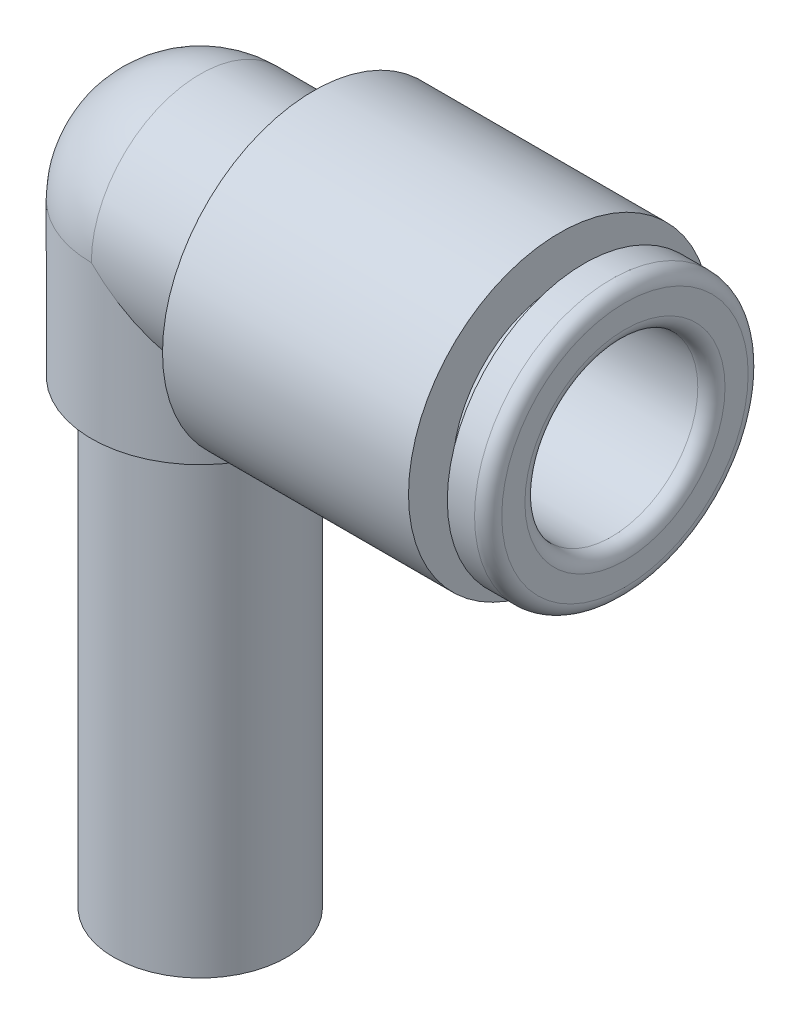
ISO-10303-21;
HEADER;
FILE_DESCRIPTION(('STEP AP214'),'2;1');
FILE_NAME('part.step','',(''),(''),'','','');
FILE_SCHEMA(('AUTOMOTIVE_DESIGN { 1 0 10303 214 1 1 1 1 }'));
ENDSEC;
DATA;
#1=APPLICATION_CONTEXT('core data for automotive mechanical design processes');
#2=APPLICATION_PROTOCOL_DEFINITION('international standard','automotive_design',2000,#1);
#3=PRODUCT_CONTEXT('',#1,'mechanical');
#4=PRODUCT('Part','Part','',(#3));
#5=PRODUCT_RELATED_PRODUCT_CATEGORY('part','',(#4));
#6=PRODUCT_DEFINITION_FORMATION('','',#4);
#7=PRODUCT_DEFINITION_CONTEXT('part definition',#1,'design');
#8=PRODUCT_DEFINITION('design','',#6,#7);
#9=PRODUCT_DEFINITION_SHAPE('','',#8);
#10=(LENGTH_UNIT() NAMED_UNIT(*) SI_UNIT(.MILLI.,.METRE.));
#11=(NAMED_UNIT(*) PLANE_ANGLE_UNIT() SI_UNIT($,.RADIAN.));
#12=(NAMED_UNIT(*) SI_UNIT($,.STERADIAN.) SOLID_ANGLE_UNIT());
#13=UNCERTAINTY_MEASURE_WITH_UNIT(LENGTH_MEASURE(1.E-05),#10,'distance_accuracy_value','');
#14=(GEOMETRIC_REPRESENTATION_CONTEXT(3) GLOBAL_UNCERTAINTY_ASSIGNED_CONTEXT((#13)) GLOBAL_UNIT_ASSIGNED_CONTEXT((#10,
#11,#12)) REPRESENTATION_CONTEXT('',''));
#15=CARTESIAN_POINT('',(0.,0.,0.));
#16=DIRECTION('',(0.,0.,1.));
#17=DIRECTION('',(1.,0.,0.));
#18=AXIS2_PLACEMENT_3D('',#15,#16,#17);
#19=CARTESIAN_POINT('',(15.1,0.,0.));
#20=DIRECTION('',(-1.,0.,0.));
#21=DIRECTION('',(0.,0.,1.));
#22=AXIS2_PLACEMENT_3D('',#19,#20,#21);
#23=TOROIDAL_SURFACE('',#22,4.525,0.5);
#24=CARTESIAN_POINT('',(15.1,0.,0.));
#25=DIRECTION('',(-1.,0.,0.));
#26=DIRECTION('',(0.,0.,1.));
#27=AXIS2_PLACEMENT_3D('',#24,#25,#26);
#28=CIRCLE('',#27,5.025);
#29=CARTESIAN_POINT('',(15.1,0.,5.025));
#30=VERTEX_POINT('',#29);
#31=EDGE_CURVE('E192',#30,#30,#28,.T.);
#32=ORIENTED_EDGE('',*,*,#31,.F.);
#33=EDGE_LOOP('',(#32));
#34=FACE_BOUND('',#33,.T.);
#35=CARTESIAN_POINT('',(15.6,0.,0.));
#36=DIRECTION('',(-1.,0.,0.));
#37=DIRECTION('',(0.,0.,1.));
#38=AXIS2_PLACEMENT_3D('',#35,#36,#37);
#39=CIRCLE('',#38,4.525);
#40=CARTESIAN_POINT('',(15.6,0.,4.525));
#41=VERTEX_POINT('',#40);
#42=CARTESIAN_POINT('',(15.6,0.,-4.525));
#43=VERTEX_POINT('',#42);
#44=EDGE_CURVE('E179',#41,#43,#39,.T.);
#45=ORIENTED_EDGE('',*,*,#44,.T.);
#46=CARTESIAN_POINT('',(15.6,0.,0.));
#47=DIRECTION('',(-1.,0.,0.));
#48=DIRECTION('',(0.,0.,-1.));
#49=AXIS2_PLACEMENT_3D('',#46,#47,#48);
#50=CIRCLE('',#49,4.525);
#51=EDGE_CURVE('E475',#43,#41,#50,.T.);
#52=ORIENTED_EDGE('',*,*,#51,.T.);
#53=EDGE_LOOP('',(#45,#52));
#54=FACE_BOUND('',#53,.T.);
#55=ADVANCED_FACE('F16',(#34,#54),#23,.T.);
#56=CARTESIAN_POINT('',(15.6,4.525,0.));
#57=DIRECTION('',(-1.,0.,0.));
#58=DIRECTION('',(0.,0.,1.));
#59=AXIS2_PLACEMENT_3D('',#56,#57,#58);
#60=PLANE('',#59);
#61=ORIENTED_EDGE('',*,*,#51,.F.);
#62=ORIENTED_EDGE('',*,*,#44,.F.);
#63=EDGE_LOOP('',(#61,#62));
#64=FACE_BOUND('',#63,.T.);
#65=CARTESIAN_POINT('',(15.6,0.,0.));
#66=DIRECTION('',(1.,0.,0.));
#67=DIRECTION('',(0.,0.,1.));
#68=AXIS2_PLACEMENT_3D('',#65,#66,#67);
#69=CIRCLE('',#68,3.675);
#70=CARTESIAN_POINT('',(15.6,0.,3.675));
#71=VERTEX_POINT('',#70);
#72=CARTESIAN_POINT('',(15.6,0.,-3.675));
#73=VERTEX_POINT('',#72);
#74=EDGE_CURVE('E146',#71,#73,#69,.T.);
#75=ORIENTED_EDGE('',*,*,#74,.F.);
#76=CARTESIAN_POINT('',(15.6,0.,0.));
#77=DIRECTION('',(1.,0.,0.));
#78=DIRECTION('',(0.,0.,-1.));
#79=AXIS2_PLACEMENT_3D('',#76,#77,#78);
#80=CIRCLE('',#79,3.675);
#81=EDGE_CURVE('E188',#73,#71,#80,.T.);
#82=ORIENTED_EDGE('',*,*,#81,.F.);
#83=EDGE_LOOP('',(#75,#82));
#84=FACE_BOUND('',#83,.T.);
#85=ADVANCED_FACE('F152',(#64,#84),#60,.F.);
#86=CARTESIAN_POINT('',(12.5977223806421,0.,0.));
#87=DIRECTION('',(-1.,0.,0.));
#88=DIRECTION('',(0.,0.,1.));
#89=AXIS2_PLACEMENT_3D('',#86,#87,#88);
#90=CYLINDRICAL_SURFACE('',#89,5.025);
#91=CARTESIAN_POINT('',(14.1,0.,0.));
#92=DIRECTION('',(-1.,0.,0.));
#93=DIRECTION('',(0.,0.,1.));
#94=AXIS2_PLACEMENT_3D('',#91,#92,#93);
#95=CIRCLE('',#94,5.025);
#96=CARTESIAN_POINT('',(14.1,0.,5.025));
#97=VERTEX_POINT('',#96);
#98=EDGE_CURVE('E461',#97,#97,#95,.F.);
#99=ORIENTED_EDGE('',*,*,#98,.T.);
#100=EDGE_LOOP('',(#99));
#101=FACE_BOUND('',#100,.T.);
#102=ORIENTED_EDGE('',*,*,#31,.T.);
#103=EDGE_LOOP('',(#102));
#104=FACE_BOUND('',#103,.T.);
#105=ADVANCED_FACE('F134',(#101,#104),#90,.T.);
#106=CARTESIAN_POINT('',(15.1,0.,0.));
#107=DIRECTION('',(-1.,0.,0.));
#108=DIRECTION('',(0.,0.,1.));
#109=AXIS2_PLACEMENT_3D('',#106,#107,#108);
#110=TOROIDAL_SURFACE('',#109,3.675,0.5);
#111=ORIENTED_EDGE('',*,*,#74,.T.);
#112=ORIENTED_EDGE('',*,*,#81,.T.);
#113=EDGE_LOOP('',(#111,#112));
#114=FACE_BOUND('',#113,.T.);
#115=CARTESIAN_POINT('',(15.1,0.,0.));
#116=DIRECTION('',(1.,0.,0.));
#117=DIRECTION('',(0.,0.,-1.));
#118=AXIS2_PLACEMENT_3D('',#115,#116,#117);
#119=CIRCLE('',#118,3.175);
#120=CARTESIAN_POINT('',(15.1,0.,-3.175));
#121=VERTEX_POINT('',#120);
#122=EDGE_CURVE('E141',#121,#121,#119,.F.);
#123=ORIENTED_EDGE('',*,*,#122,.T.);
#124=EDGE_LOOP('',(#123));
#125=FACE_BOUND('',#124,.T.);
#126=ADVANCED_FACE('F128',(#114,#125),#110,.T.);
#127=CARTESIAN_POINT('',(14.1,3.925,0.));
#128=DIRECTION('',(1.,0.,0.));
#129=DIRECTION('',(0.,0.,-1.));
#130=AXIS2_PLACEMENT_3D('',#127,#128,#129);
#131=PLANE('',#130);
#132=ORIENTED_EDGE('',*,*,#98,.F.);
#133=EDGE_LOOP('',(#132));
#134=FACE_BOUND('',#133,.T.);
#135=CARTESIAN_POINT('',(14.1,0.,0.));
#136=DIRECTION('',(-1.,0.,0.));
#137=DIRECTION('',(0.,0.,1.));
#138=AXIS2_PLACEMENT_3D('',#135,#136,#137);
#139=CIRCLE('',#138,3.925);
#140=CARTESIAN_POINT('',(14.1,0.,3.925));
#141=VERTEX_POINT('',#140);
#142=EDGE_CURVE('E464',#141,#141,#139,.T.);
#143=ORIENTED_EDGE('',*,*,#142,.F.);
#144=EDGE_LOOP('',(#143));
#145=FACE_BOUND('',#144,.T.);
#146=ADVANCED_FACE('F124',(#134,#145),#131,.F.);
#147=CARTESIAN_POINT('',(-6.68025612106916,0.,0.));
#148=DIRECTION('',(1.,0.,0.));
#149=DIRECTION('',(0.,0.,-1.));
#150=AXIS2_PLACEMENT_3D('',#147,#148,#149);
#151=CYLINDRICAL_SURFACE('',#150,3.175);
#152=CARTESIAN_POINT('',(2.3,0.,0.));
#153=DIRECTION('',(1.,0.,0.));
#154=DIRECTION('',(0.,0.,-1.));
#155=AXIS2_PLACEMENT_3D('',#152,#153,#154);
#156=CIRCLE('',#155,3.175);
#157=CARTESIAN_POINT('',(2.3,0.,-3.175));
#158=VERTEX_POINT('',#157);
#159=EDGE_CURVE('E480',#158,#158,#156,.T.);
#160=ORIENTED_EDGE('',*,*,#159,.F.);
#161=EDGE_LOOP('',(#160));
#162=FACE_BOUND('',#161,.T.);
#163=ORIENTED_EDGE('',*,*,#122,.F.);
#164=EDGE_LOOP('',(#163));
#165=FACE_BOUND('',#164,.T.);
#166=ADVANCED_FACE('F120',(#162,#165),#151,.F.);
#167=CARTESIAN_POINT('',(12.5977223806421,0.,0.));
#168=DIRECTION('',(-1.,0.,0.));
#169=DIRECTION('',(0.,0.,1.));
#170=AXIS2_PLACEMENT_3D('',#167,#168,#169);
#171=CYLINDRICAL_SURFACE('',#170,3.925);
#172=ORIENTED_EDGE('',*,*,#142,.T.);
#173=EDGE_LOOP('',(#172));
#174=FACE_BOUND('',#173,.T.);
#175=CARTESIAN_POINT('',(13.2,0.,0.));
#176=DIRECTION('',(-1.,0.,0.));
#177=DIRECTION('',(0.,0.,1.));
#178=AXIS2_PLACEMENT_3D('',#175,#176,#177);
#179=CIRCLE('',#178,3.925);
#180=CARTESIAN_POINT('',(13.2,0.,3.925));
#181=VERTEX_POINT('',#180);
#182=EDGE_CURVE('E104',#181,#181,#179,.T.);
#183=ORIENTED_EDGE('',*,*,#182,.F.);
#184=EDGE_LOOP('',(#183));
#185=FACE_BOUND('',#184,.T.);
#186=ADVANCED_FACE('F116',(#174,#185),#171,.T.);
#187=CARTESIAN_POINT('',(2.3,0.,0.));
#188=DIRECTION('',(1.,0.,0.));
#189=DIRECTION('',(0.,0.,-1.));
#190=AXIS2_PLACEMENT_3D('',#187,#188,#189);
#191=PLANE('',#190);
#192=ORIENTED_EDGE('',*,*,#159,.T.);
#193=EDGE_LOOP('',(#192));
#194=FACE_BOUND('',#193,.T.);
#195=CARTESIAN_POINT('',(2.3,1.5875,0.));
#196=CARTESIAN_POINT('',(2.3,1.58749495491175,-0.0891042427531741));
#197=CARTESIAN_POINT('',(2.3,1.5799567594767,-0.178367065825004));
#198=CARTESIAN_POINT('',(2.3,1.55752593931099,-0.310284978882648));
#199=CARTESIAN_POINT('',(2.3,1.54817551801793,-0.353984136220303));
#200=CARTESIAN_POINT('',(2.3,1.52581986383247,-0.440482597009062));
#201=CARTESIAN_POINT('',(2.3,1.51281166503759,-0.483281139802836));
#202=CARTESIAN_POINT('',(2.3,1.46847935042481,-0.609650731482703));
#203=CARTESIAN_POINT('',(2.3,1.43181110468509,-0.691408444623856));
#204=CARTESIAN_POINT('',(2.3,1.34525124947605,-0.847600873434349));
#205=CARTESIAN_POINT('',(2.3,1.29535913733055,-0.92203531057795));
#206=CARTESIAN_POINT('',(2.3,1.21173203000345,-1.02657774769047));
#207=CARTESIAN_POINT('',(2.3,1.18236942307022,-1.06026005137225));
#208=CARTESIAN_POINT('',(2.3,1.12094417118544,-1.12500228697802));
#209=CARTESIAN_POINT('',(2.3,1.08888415677228,-1.15606471595275));
#210=CARTESIAN_POINT('',(2.3,0.988914300007536,-1.24505027809715));
#211=CARTESIAN_POINT('',(2.3,0.91719651899173,-1.29879429940031));
#212=CARTESIAN_POINT('',(2.3,0.765794987238496,-1.39344725535452));
#213=CARTESIAN_POINT('',(2.3,0.68611153702384,-1.43435667397899));
#214=CARTESIAN_POINT('',(2.3,0.520998674629221,-1.50222466101312));
#215=CARTESIAN_POINT('',(2.3,0.435569323829171,-1.52918337842279));
#216=CARTESIAN_POINT('',(2.3,0.261399162889878,-1.56837371201757));
#217=CARTESIAN_POINT('',(2.3,0.172658335068551,-1.5806052495533));
#218=CARTESIAN_POINT('',(2.3,-0.00561731240755867,-1.58999757905017));
#219=CARTESIAN_POINT('',(2.3,-0.0951521320623415,-1.58715837101132));
#220=CARTESIAN_POINT('',(2.3,-0.272476104421436,-1.56648626333742));
#221=CARTESIAN_POINT('',(2.3,-0.360265266445705,-1.54865344377437));
#222=CARTESIAN_POINT('',(2.3,-0.531595441405979,-1.49851072605493));
#223=CARTESIAN_POINT('',(2.3,-0.615136408958334,-1.46620067327378));
#224=CARTESIAN_POINT('',(2.3,-0.775645641169254,-1.38798052073523));
#225=CARTESIAN_POINT('',(2.3,-0.852613657823175,-1.3420699081056));
#226=CARTESIAN_POINT('',(2.3,-0.961380423495979,-1.26408149090922));
#227=CARTESIAN_POINT('',(2.3,-0.996526902392936,-1.23655978966952));
#228=CARTESIAN_POINT('',(2.3,-1.06441502738068,-1.1786303401124));
#229=CARTESIAN_POINT('',(2.3,-1.097154319878,-1.14821983215871));
#230=CARTESIAN_POINT('',(2.3,-1.19130347726346,-1.05304341490668));
#231=CARTESIAN_POINT('',(2.3,-1.24874073602495,-0.984263551623961));
#232=CARTESIAN_POINT('',(2.3,-1.35123363022916,-0.838031236490894));
#233=CARTESIAN_POINT('',(2.3,-1.39628973629864,-0.760579114444078));
#234=CARTESIAN_POINT('',(2.3,-1.45365516445471,-0.639567398181835));
#235=CARTESIAN_POINT('',(2.3,-1.47108849203858,-0.598372646204052));
#236=CARTESIAN_POINT('',(2.3,-1.50240938310877,-0.514702097171229));
#237=CARTESIAN_POINT('',(2.3,-1.51629981615103,-0.472227368210621));
#238=CARTESIAN_POINT('',(2.3,-1.55246799527504,-0.343396703003752));
#239=CARTESIAN_POINT('',(2.3,-1.56934392647251,-0.255420121350519));
#240=CARTESIAN_POINT('',(2.3,-1.5816411099694,-0.139100766828972));
#241=CARTESIAN_POINT('',(2.3,-1.58383629738819,-0.111329870710185));
#242=CARTESIAN_POINT('',(2.3,-1.58676653121529,-0.055711151950809));
#243=CARTESIAN_POINT('',(2.3,-1.58750157762359,-0.0278633293102198));
#244=CARTESIAN_POINT('',(2.3,-1.58749495491175,0.0891042427531827));
#245=CARTESIAN_POINT('',(2.3,-1.5799567594767,0.178367065825021));
#246=CARTESIAN_POINT('',(2.3,-1.55752593931099,0.310284978882677));
#247=CARTESIAN_POINT('',(2.3,-1.54817551801793,0.353984136220336));
#248=CARTESIAN_POINT('',(2.3,-1.52581986383246,0.440482597009103));
#249=CARTESIAN_POINT('',(2.3,-1.51281166503757,0.48328113980288));
#250=CARTESIAN_POINT('',(2.3,-1.46847935042479,0.609650731482749));
#251=CARTESIAN_POINT('',(2.3,-1.43181110468507,0.691408444623901));
#252=CARTESIAN_POINT('',(2.3,-1.34525124947603,0.847600873434392));
#253=CARTESIAN_POINT('',(2.3,-1.29535913733053,0.922035310577991));
#254=CARTESIAN_POINT('',(2.3,-1.21173203000341,1.02657774769051));
#255=CARTESIAN_POINT('',(2.3,-1.18236942307018,1.06026005137229));
#256=CARTESIAN_POINT('',(2.3,-1.1209441711854,1.12500228697806));
#257=CARTESIAN_POINT('',(2.3,-1.08888415677224,1.15606471595278));
#258=CARTESIAN_POINT('',(2.3,-0.988914300007496,1.24505027809718));
#259=CARTESIAN_POINT('',(2.3,-0.917196518991689,1.29879429940034));
#260=CARTESIAN_POINT('',(2.3,-0.765794987238453,1.39344725535454));
#261=CARTESIAN_POINT('',(2.3,-0.686111537023795,1.43435667397901));
#262=CARTESIAN_POINT('',(2.3,-0.520998674629174,1.50222466101314));
#263=CARTESIAN_POINT('',(2.3,-0.435569323829124,1.5291833784228));
#264=CARTESIAN_POINT('',(2.3,-0.26139916288983,1.56837371201758));
#265=CARTESIAN_POINT('',(2.3,-0.172658335068503,1.58060524955331));
#266=CARTESIAN_POINT('',(2.3,0.00561731240760763,1.58999757905017));
#267=CARTESIAN_POINT('',(2.3,0.0951521320623905,1.58715837101131));
#268=CARTESIAN_POINT('',(2.3,0.272476104421484,1.56648626333742));
#269=CARTESIAN_POINT('',(2.3,0.360265266445752,1.54865344377436));
#270=CARTESIAN_POINT('',(2.3,0.531595441406026,1.49851072605491));
#271=CARTESIAN_POINT('',(2.3,0.615136408958379,1.46620067327377));
#272=CARTESIAN_POINT('',(2.3,0.775645641169297,1.3879805207352));
#273=CARTESIAN_POINT('',(2.3,0.852613657823216,1.34206990810557));
#274=CARTESIAN_POINT('',(2.3,0.961380423496018,1.26408149090919));
#275=CARTESIAN_POINT('',(2.3,0.996526902392974,1.23655978966949));
#276=CARTESIAN_POINT('',(2.3,1.06441502738072,1.17863034011237));
#277=CARTESIAN_POINT('',(2.3,1.09715431987803,1.14821983215867));
#278=CARTESIAN_POINT('',(2.3,1.1913034772635,1.05304341490664));
#279=CARTESIAN_POINT('',(2.3,1.24874073602498,0.984263551623922));
#280=CARTESIAN_POINT('',(2.3,1.35123363022918,0.838031236490852));
#281=CARTESIAN_POINT('',(2.3,1.39628973629866,0.760579114444035));
#282=CARTESIAN_POINT('',(2.3,1.45365516445473,0.63956739818179));
#283=CARTESIAN_POINT('',(2.3,1.4710884920386,0.598372646204007));
#284=CARTESIAN_POINT('',(2.3,1.50240938310878,0.514702097171183));
#285=CARTESIAN_POINT('',(2.3,1.51629981615105,0.472227368210575));
#286=CARTESIAN_POINT('',(2.3,1.55246799527505,0.343396703003704));
#287=CARTESIAN_POINT('',(2.3,1.56934392647252,0.255420121350471));
#288=CARTESIAN_POINT('',(2.3,1.5816411099694,0.139100766828931));
#289=CARTESIAN_POINT('',(2.3,1.58383629738819,0.111329870710153));
#290=CARTESIAN_POINT('',(2.3,1.58676653121529,0.0557111519507928));
#291=CARTESIAN_POINT('',(2.3,1.58750157762359,0.0278633293102118));
#292=CARTESIAN_POINT('',(2.3,1.5875,0.));
#293=B_SPLINE_CURVE_WITH_KNOTS('',3,(#195,#196,#197,#198,#199,#200,#201,#202,#203,#204,#205,
#206,#207,#208,#209,#210,#211,#212,#213,#214,#215,#216,#217,#218,#219,#220,#221,#222,#223,#224,
#225,#226,#227,#228,#229,#230,#231,#232,#233,#234,#235,#236,#237,#238,#239,#240,#241,#242,#243,
#244,#245,#246,#247,#248,#249,#250,#251,#252,#253,#254,#255,#256,#257,#258,#259,#260,#261,#262,
#263,#264,#265,#266,#267,#268,#269,#270,#271,#272,#273,#274,#275,#276,#277,#278,#279,#280,#281,
#282,#283,#284,#285,#286,#287,#288,#289,#290,#291,#292),.UNSPECIFIED.,.T.,.F.,(4,2,2,2,2,2,2,2,
2,2,2,2,2,2,2,2,2,2,2,2,2,2,2,2,2,2,2,2,2,2,2,2,2,2,2,2,2,2,2,2,2,2,2,2,2,2,2,2,4),(0.,
0.267183072661366,0.401125762560115,0.535177374399008,0.802641589880362,1.07011597388379,
1.20402841156871,1.33781173749441,1.60529255313183,1.87276328126013,2.14023115261725,
2.40770045235999,2.67516975210272,2.94263762345984,3.21010835158814,3.47758916722556,
3.61137249315127,3.74528493083618,4.01275931483961,4.28022353032096,4.41427514215986,
4.54821783205861,4.81540090471997,4.89895034871561,4.98249979271125,5.24968286537264,
5.3836255552714,5.51767716711031,5.78514138259166,6.05261576659509,6.18652820428,
6.32031153020571,6.58779234584313,6.85526307397143,7.12273094532855,7.39020024507128,
7.65766954481402,7.92513741617114,8.19260814429943,8.46008895993686,8.59387228586256,
8.72778472354748,8.9952591075509,9.26272332303226,9.39677493487115,9.5307176247699,
9.79790069743127,9.88145014142688,9.96499958542249),.UNSPECIFIED.);
#294=CARTESIAN_POINT('',(2.3,1.5875,0.));
#295=VERTEX_POINT('',#294);
#296=EDGE_CURVE('E96',#295,#295,#293,.T.);
#297=ORIENTED_EDGE('',*,*,#296,.T.);
#298=EDGE_LOOP('',(#297));
#299=FACE_BOUND('',#298,.T.);
#300=ADVANCED_FACE('F111',(#194,#299),#191,.T.);
#301=CARTESIAN_POINT('',(13.2,0.,0.));
#302=DIRECTION('',(1.,0.,0.));
#303=DIRECTION('',(0.,0.,-1.));
#304=AXIS2_PLACEMENT_3D('',#301,#302,#303);
#305=PLANE('',#304);
#306=ORIENTED_EDGE('',*,*,#182,.T.);
#307=EDGE_LOOP('',(#306));
#308=FACE_BOUND('',#307,.T.);
#309=CARTESIAN_POINT('',(13.2,0.,0.));
#310=DIRECTION('',(-1.,0.,0.));
#311=DIRECTION('',(0.,0.,1.));
#312=AXIS2_PLACEMENT_3D('',#309,#310,#311);
#313=CIRCLE('',#312,5.55);
#314=CARTESIAN_POINT('',(13.2,0.,5.55));
#315=VERTEX_POINT('',#314);
#316=EDGE_CURVE('E92',#315,#315,#313,.T.);
#317=ORIENTED_EDGE('',*,*,#316,.F.);
#318=EDGE_LOOP('',(#317));
#319=FACE_BOUND('',#318,.T.);
#320=ADVANCED_FACE('F115',(#308,#319),#305,.T.);
#321=CARTESIAN_POINT('',(2.3,-2.29999999999993,0.));
#322=DIRECTION('',(0.,0.,-1.));
#323=DIRECTION('',(-1.,0.,0.));
#324=AXIS2_PLACEMENT_3D('',#321,#322,#323);
#325=TOROIDAL_SURFACE('',#324,2.29999999999993,1.5875);
#326=CARTESIAN_POINT('',(0.,-2.29999999999993,0.));
#327=DIRECTION('',(0.,-1.,0.));
#328=DIRECTION('',(0.,0.,-1.));
#329=AXIS2_PLACEMENT_3D('',#326,#327,#328);
#330=CIRCLE('',#329,1.5875);
#331=CARTESIAN_POINT('',(0.,-2.29999999999993,-1.5875));
#332=VERTEX_POINT('',#331);
#333=EDGE_CURVE('E95',#332,#332,#330,.T.);
#334=ORIENTED_EDGE('',*,*,#333,.T.);
#335=EDGE_LOOP('',(#334));
#336=FACE_BOUND('',#335,.T.);
#337=ORIENTED_EDGE('',*,*,#296,.F.);
#338=EDGE_LOOP('',(#337));
#339=FACE_BOUND('',#338,.T.);
#340=ADVANCED_FACE('F106',(#336,#339),#325,.F.);
#341=CARTESIAN_POINT('',(28.8977705423414,0.,0.));
#342=DIRECTION('',(-1.,0.,0.));
#343=DIRECTION('',(0.,0.,1.));
#344=AXIS2_PLACEMENT_3D('',#341,#342,#343);
#345=CYLINDRICAL_SURFACE('',#344,5.55);
#346=ORIENTED_EDGE('',*,*,#316,.T.);
#347=EDGE_LOOP('',(#346));
#348=FACE_BOUND('',#347,.T.);
#349=CARTESIAN_POINT('',(4.16415386311542,0.,0.));
#350=DIRECTION('',(1.,0.,0.));
#351=DIRECTION('',(0.,0.,-1.));
#352=AXIS2_PLACEMENT_3D('',#349,#350,#351);
#353=CIRCLE('',#352,5.55000000002792);
#354=CARTESIAN_POINT('',(4.16415386311542,0.,-5.55000000002792));
#355=VERTEX_POINT('',#354);
#356=EDGE_CURVE('E71',#355,#355,#353,.F.);
#357=ORIENTED_EDGE('',*,*,#356,.F.);
#358=EDGE_LOOP('',(#357));
#359=FACE_BOUND('',#358,.T.);
#360=ADVANCED_FACE('F239',(#348,#359),#345,.T.);
#361=CARTESIAN_POINT('',(0.,5.551,0.));
#362=DIRECTION('',(0.,-1.,0.));
#363=DIRECTION('',(0.,0.,-1.));
#364=AXIS2_PLACEMENT_3D('',#361,#362,#363);
#365=CYLINDRICAL_SURFACE('',#364,1.5875);
#366=CARTESIAN_POINT('',(0.,-22.8,0.));
#367=DIRECTION('',(0.,-1.,0.));
#368=DIRECTION('',(0.,0.,-1.));
#369=AXIS2_PLACEMENT_3D('',#366,#367,#368);
#370=CIRCLE('',#369,1.5875);
#371=CARTESIAN_POINT('',(0.,-22.8,-1.5875));
#372=VERTEX_POINT('',#371);
#373=EDGE_CURVE('E80',#372,#372,#370,.T.);
#374=ORIENTED_EDGE('',*,*,#373,.T.);
#375=EDGE_LOOP('',(#374));
#376=FACE_BOUND('',#375,.T.);
#377=ORIENTED_EDGE('',*,*,#333,.F.);
#378=EDGE_LOOP('',(#377));
#379=FACE_BOUND('',#378,.T.);
#380=ADVANCED_FACE('F236',(#376,#379),#365,.F.);
#381=CARTESIAN_POINT('',(4.16415386303015,0.,0.));
#382=DIRECTION('',(1.,0.,0.));
#383=DIRECTION('',(0.,0.,-1.));
#384=AXIS2_PLACEMENT_3D('',#381,#382,#383);
#385=CONICAL_SURFACE('',#384,5.54999999980055,1.22173047639958);
#386=ORIENTED_EDGE('',*,*,#356,.T.);
#387=EDGE_LOOP('',(#386));
#388=FACE_BOUND('',#387,.T.);
#389=CARTESIAN_POINT('',(3.59999999999844,-3.60000000000479,-1.74355957741951));
#390=CARTESIAN_POINT('',(3.62157637936328,-3.68744298047734,-1.69895035369096));
#391=CARTESIAN_POINT('',(3.64326188821698,-3.77380115947917,-1.6521187470047));
#392=CARTESIAN_POINT('',(3.68660443299061,-3.94391395593988,-1.55304276251726));
#393=CARTESIAN_POINT('',(3.70826086785694,-4.02765460311734,-1.50077423314749));
#394=CARTESIAN_POINT('',(3.75148150275558,-4.19275989754303,-1.38925077896156));
#395=CARTESIAN_POINT('',(3.77303683789505,-4.27405348486269,-1.32988594164953));
#396=CARTESIAN_POINT('',(3.81507761899884,-4.43099816210929,-1.20398835816664));
#397=CARTESIAN_POINT('',(3.83556516580436,-4.50666046753804,-1.13747054175666));
#398=CARTESIAN_POINT('',(3.87167932946195,-4.63894985622204,-1.00694435380232));
#399=CARTESIAN_POINT('',(3.88756552556941,-4.69670469555088,-0.944164963508806));
#400=CARTESIAN_POINT('',(3.91734344627283,-4.80436580386867,-0.811795162386883));
#401=CARTESIAN_POINT('',(3.93123804137627,-4.85428337886456,-0.742214802335059));
#402=CARTESIAN_POINT('',(3.95630031249986,-4.94395653394926,-0.594475309598016));
#403=CARTESIAN_POINT('',(3.96741684448768,-4.98352207660165,-0.516188955083546));
#404=CARTESIAN_POINT('',(3.98521893268869,-5.04673292245621,-0.353055078042497));
#405=CARTESIAN_POINT('',(3.99192667687574,-5.0704579554242,-0.268242847758345));
#406=CARTESIAN_POINT('',(3.99723262168668,-5.08921425522663,-0.151825133406507));
#407=CARTESIAN_POINT('',(3.99826658488713,-5.09286764939207,-0.121598223866252));
#408=CARTESIAN_POINT('',(3.99965108851408,-5.09775878513245,-0.0609199637345642));
#409=CARTESIAN_POINT('',(4.00000134353799,-5.09899551791257,-0.0304685247387774));
#410=CARTESIAN_POINT('',(3.99999702086985,-5.09898087849809,0.0675602053539426));
#411=CARTESIAN_POINT('',(3.99826531575926,-5.09286769830587,0.135204417216153));
#412=CARTESIAN_POINT('',(3.99155221087839,-5.06913025824595,0.268300266355725));
#413=CARTESIAN_POINT('',(3.98656409276117,-5.05148220053705,0.333747075994445));
#414=CARTESIAN_POINT('',(3.9722724487991,-5.00078218873033,0.476919959094931));
#415=CARTESIAN_POINT('',(3.96219765702689,-4.96496719250055,0.553577955238808));
#416=CARTESIAN_POINT('',(3.9389833004672,-4.88204468106476,0.699952892381912));
#417=CARTESIAN_POINT('',(3.92583760002666,-4.83491455301117,0.769655533409828));
#418=CARTESIAN_POINT('',(3.88802104017811,-4.69851454949023,0.946651136164047));
#419=CARTESIAN_POINT('',(3.86151375293236,-4.60211367659662,1.04798409904383));
#420=CARTESIAN_POINT('',(3.80565206814339,-4.39618147825982,1.23555881573003));
#421=CARTESIAN_POINT('',(3.77628599584542,-4.28659583923226,1.32173427700929));
#422=CARTESIAN_POINT('',(3.72221348953757,-4.08133201334287,1.46623765708628));
#423=CARTESIAN_POINT('',(3.69771042107058,-3.98708912538814,1.52672293919465));
#424=CARTESIAN_POINT('',(3.64875450062857,-3.79564982467023,1.64020861855211));
#425=CARTESIAN_POINT('',(3.62430412486497,-3.69849795667435,1.69328482682591));
#426=CARTESIAN_POINT('',(3.59999999999791,-3.60000000000261,1.74355957742062));
#427=B_SPLINE_CURVE_WITH_KNOTS('',3,(#389,#390,#391,#392,#393,#394,#395,#396,#397,#398,#399,
#400,#401,#402,#403,#404,#405,#406,#407,#408,#409,#410,#411,#412,#413,#414,#415,#416,#417,#418,
#419,#420,#421,#422,#423,#424,#425,#426),.UNSPECIFIED.,.F.,.F.,(4,2,2,2,2,2,2,2,2,2,2,2,2,2,2,2,
2,2,4),(0.,0.301591766742151,0.604585620072048,0.913098344332173,1.22097919750965,
1.48080234546781,1.74024715962726,2.0041649827749,2.2667442123053,2.35805155680395,
2.449397007889,2.65194430830573,2.85491081287061,3.10908674424826,3.36377492765103,
3.78844492651906,4.21492841187819,4.55854041404751,4.89832818337542),.UNSPECIFIED.);
#428=CARTESIAN_POINT('',(3.60000000000213,-3.60000000001096,-1.74355957742211));
#429=VERTEX_POINT('',#428);
#430=CARTESIAN_POINT('',(3.59999999999968,-3.60000000000007,1.74355957741638));
#431=VERTEX_POINT('',#430);
#432=EDGE_CURVE('E73',#429,#431,#427,.T.);
#433=ORIENTED_EDGE('',*,*,#432,.F.);
#434=CARTESIAN_POINT('',(3.60000000000001,0.,0.));
#435=DIRECTION('',(-1.,0.,0.));
#436=DIRECTION('',(0.,0.,1.));
#437=AXIS2_PLACEMENT_3D('',#434,#435,#436);
#438=CIRCLE('',#437,4.);
#439=EDGE_CURVE('E62',#431,#429,#438,.T.);
#440=ORIENTED_EDGE('',*,*,#439,.F.);
#441=EDGE_LOOP('',(#433,#440));
#442=FACE_BOUND('',#441,.T.);
#443=ADVANCED_FACE('F74',(#388,#442),#385,.T.);
#444=CARTESIAN_POINT('',(14.9137084989848,0.,0.));
#445=DIRECTION('',(-1.,0.,0.));
#446=DIRECTION('',(0.,0.,1.));
#447=AXIS2_PLACEMENT_3D('',#444,#445,#446);
#448=CYLINDRICAL_SURFACE('',#447,4.);
#449=ORIENTED_EDGE('',*,*,#439,.T.);
#450=CARTESIAN_POINT('',(0.,0.,0.));
#451=DIRECTION('',(-0.707106781186546,-0.707106781186549,0.));
#452=DIRECTION('',(-0.707106781186549,0.707106781186546,0.));
#453=AXIS2_PLACEMENT_3D('',#450,#451,#452);
#454=ELLIPSE('',#453,5.65685424949239,4.);
#455=CARTESIAN_POINT('',(0.,0.,-4.));
#456=VERTEX_POINT('',#455);
#457=EDGE_CURVE('E66',#456,#429,#454,.T.);
#458=ORIENTED_EDGE('',*,*,#457,.F.);
#459=CARTESIAN_POINT('',(0.,0.,0.));
#460=DIRECTION('',(-1.,0.,0.));
#461=DIRECTION('',(0.,0.,1.));
#462=AXIS2_PLACEMENT_3D('',#459,#460,#461);
#463=CIRCLE('',#462,4.);
#464=CARTESIAN_POINT('',(0.,0.,4.));
#465=VERTEX_POINT('',#464);
#466=EDGE_CURVE('E57',#465,#456,#463,.T.);
#467=ORIENTED_EDGE('',*,*,#466,.F.);
#468=CARTESIAN_POINT('',(0.,0.,0.));
#469=DIRECTION('',(-0.707106781186546,-0.707106781186549,0.));
#470=DIRECTION('',(-0.707106781186549,0.707106781186546,0.));
#471=AXIS2_PLACEMENT_3D('',#468,#469,#470);
#472=ELLIPSE('',#471,5.65685424949239,4.);
#473=EDGE_CURVE('E68',#431,#465,#472,.T.);
#474=ORIENTED_EDGE('',*,*,#473,.F.);
#475=EDGE_LOOP('',(#449,#458,#467,#474));
#476=FACE_BOUND('',#475,.T.);
#477=ADVANCED_FACE('F64',(#476),#448,.T.);
#478=CARTESIAN_POINT('',(0.,0.,0.));
#479=DIRECTION('',(-1.,0.,0.));
#480=DIRECTION('',(0.,0.,1.));
#481=AXIS2_PLACEMENT_3D('',#478,#479,#480);
#482=SPHERICAL_SURFACE('',#481,4.);
#483=CARTESIAN_POINT('',(0.,0.,0.));
#484=DIRECTION('',(0.,1.,0.));
#485=DIRECTION('',(-1.,0.,0.));
#486=AXIS2_PLACEMENT_3D('',#483,#484,#485);
#487=CIRCLE('',#486,4.);
#488=CARTESIAN_POINT('',(-4.,0.,0.));
#489=VERTEX_POINT('',#488);
#490=EDGE_CURVE('E37',#489,#456,#487,.F.);
#491=ORIENTED_EDGE('',*,*,#490,.F.);
#492=CARTESIAN_POINT('',(0.,0.,0.));
#493=DIRECTION('',(0.,1.,0.));
#494=DIRECTION('',(-1.,0.,0.));
#495=AXIS2_PLACEMENT_3D('',#492,#493,#494);
#496=CIRCLE('',#495,4.);
#497=EDGE_CURVE('E216',#465,#489,#496,.F.);
#498=ORIENTED_EDGE('',*,*,#497,.F.);
#499=ORIENTED_EDGE('',*,*,#466,.T.);
#500=EDGE_LOOP('',(#491,#498,#499));
#501=FACE_BOUND('',#500,.T.);
#502=ADVANCED_FACE('F227',(#501),#482,.T.);
#503=CARTESIAN_POINT('',(0.,-22.8,0.));
#504=DIRECTION('',(0.,1.,0.));
#505=DIRECTION('',(0.,0.,1.));
#506=AXIS2_PLACEMENT_3D('',#503,#504,#505);
#507=PLANE('',#506);
#508=ORIENTED_EDGE('',*,*,#373,.F.);
#509=EDGE_LOOP('',(#508));
#510=FACE_BOUND('',#509,.T.);
#511=CARTESIAN_POINT('',(0.,-22.7999999999611,0.));
#512=DIRECTION('',(0.,1.,0.));
#513=DIRECTION('',(0.,0.,1.));
#514=AXIS2_PLACEMENT_3D('',#511,#512,#513);
#515=CIRCLE('',#514,2.67500000001064);
#516=CARTESIAN_POINT('',(0.,-22.7999999999611,2.67500000001064));
#517=VERTEX_POINT('',#516);
#518=EDGE_CURVE('E214',#517,#517,#515,.T.);
#519=ORIENTED_EDGE('',*,*,#518,.F.);
#520=EDGE_LOOP('',(#519));
#521=FACE_BOUND('',#520,.T.);
#522=ADVANCED_FACE('F231',(#510,#521),#507,.F.);
#523=CARTESIAN_POINT('',(0.,-16.9137084989848,0.));
#524=DIRECTION('',(0.,1.,0.));
#525=DIRECTION('',(-1.,0.,0.));
#526=AXIS2_PLACEMENT_3D('',#523,#524,#525);
#527=CYLINDRICAL_SURFACE('',#526,4.);
#528=ORIENTED_EDGE('',*,*,#457,.T.);
#529=ORIENTED_EDGE('',*,*,#432,.T.);
#530=ORIENTED_EDGE('',*,*,#473,.T.);
#531=ORIENTED_EDGE('',*,*,#497,.T.);
#532=ORIENTED_EDGE('',*,*,#490,.T.);
#533=EDGE_LOOP('',(#528,#529,#530,#531,#532));
#534=FACE_BOUND('',#533,.T.);
#535=CARTESIAN_POINT('',(0.,-5.59999999999999,0.));
#536=DIRECTION('',(0.,1.,0.));
#537=DIRECTION('',(-1.,0.,0.));
#538=AXIS2_PLACEMENT_3D('',#535,#536,#537);
#539=CIRCLE('',#538,4.);
#540=CARTESIAN_POINT('',(-3.99999999999998,-5.6,0.));
#541=VERTEX_POINT('',#540);
#542=EDGE_CURVE('E211',#541,#541,#539,.T.);
#543=ORIENTED_EDGE('',*,*,#542,.T.);
#544=EDGE_LOOP('',(#543));
#545=FACE_BOUND('',#544,.T.);
#546=ADVANCED_FACE('F77',(#534,#545),#527,.T.);
#547=CARTESIAN_POINT('',(0.,-22.511324865377,0.));
#548=DIRECTION('',(0.,1.,0.));
#549=DIRECTION('',(0.,0.,1.));
#550=AXIS2_PLACEMENT_3D('',#547,#548,#549);
#551=CONICAL_SURFACE('',#550,3.17499999999882,1.04719755120245);
#552=CARTESIAN_POINT('',(0.,-22.5113248654052,0.));
#553=DIRECTION('',(0.,1.,0.));
#554=DIRECTION('',(0.,0.,1.));
#555=AXIS2_PLACEMENT_3D('',#552,#553,#554);
#556=CIRCLE('',#555,3.175);
#557=CARTESIAN_POINT('',(0.,-22.5113248654052,3.175));
#558=VERTEX_POINT('',#557);
#559=EDGE_CURVE('E28',#558,#558,#556,.T.);
#560=ORIENTED_EDGE('',*,*,#559,.F.);
#561=EDGE_LOOP('',(#560));
#562=FACE_BOUND('',#561,.T.);
#563=ORIENTED_EDGE('',*,*,#518,.T.);
#564=EDGE_LOOP('',(#563));
#565=FACE_BOUND('',#564,.T.);
#566=ADVANCED_FACE('F257',(#562,#565),#551,.T.);
#567=CARTESIAN_POINT('',(0.,-5.6,0.));
#568=DIRECTION('',(0.,1.,0.));
#569=DIRECTION('',(0.,0.,1.));
#570=AXIS2_PLACEMENT_3D('',#567,#568,#569);
#571=PLANE('',#570);
#572=ORIENTED_EDGE('',*,*,#542,.F.);
#573=EDGE_LOOP('',(#572));
#574=FACE_BOUND('',#573,.T.);
#575=CARTESIAN_POINT('',(0.,-5.6,0.));
#576=DIRECTION('',(0.,1.,0.));
#577=DIRECTION('',(0.,0.,1.));
#578=AXIS2_PLACEMENT_3D('',#575,#576,#577);
#579=CIRCLE('',#578,3.175);
#580=CARTESIAN_POINT('',(0.,-5.6,3.175));
#581=VERTEX_POINT('',#580);
#582=EDGE_CURVE('E11',#581,#581,#579,.F.);
#583=ORIENTED_EDGE('',*,*,#582,.F.);
#584=EDGE_LOOP('',(#583));
#585=FACE_BOUND('',#584,.T.);
#586=ADVANCED_FACE('F251',(#574,#585),#571,.F.);
#587=CARTESIAN_POINT('',(0.,-31.7802561210692,0.));
#588=DIRECTION('',(0.,1.,0.));
#589=DIRECTION('',(0.,0.,1.));
#590=AXIS2_PLACEMENT_3D('',#587,#588,#589);
#591=CYLINDRICAL_SURFACE('',#590,3.175);
#592=ORIENTED_EDGE('',*,*,#582,.T.);
#593=EDGE_LOOP('',(#592));
#594=FACE_BOUND('',#593,.T.);
#595=ORIENTED_EDGE('',*,*,#559,.T.);
#596=EDGE_LOOP('',(#595));
#597=FACE_BOUND('',#596,.T.);
#598=ADVANCED_FACE('F249',(#594,#597),#591,.T.);
#599=CLOSED_SHELL('',(#55,#85,#105,#126,#146,#166,#186,#300,#320,#340,#360,#380,#443,#477,#502,
#522,#546,#566,#586,#598));
#600=MANIFOLD_SOLID_BREP('B1',#599);
#601=ADVANCED_BREP_SHAPE_REPRESENTATION('',(#18,#600),#14);
#602=SHAPE_DEFINITION_REPRESENTATION(#9,#601);
ENDSEC;
END-ISO-10303-21;
